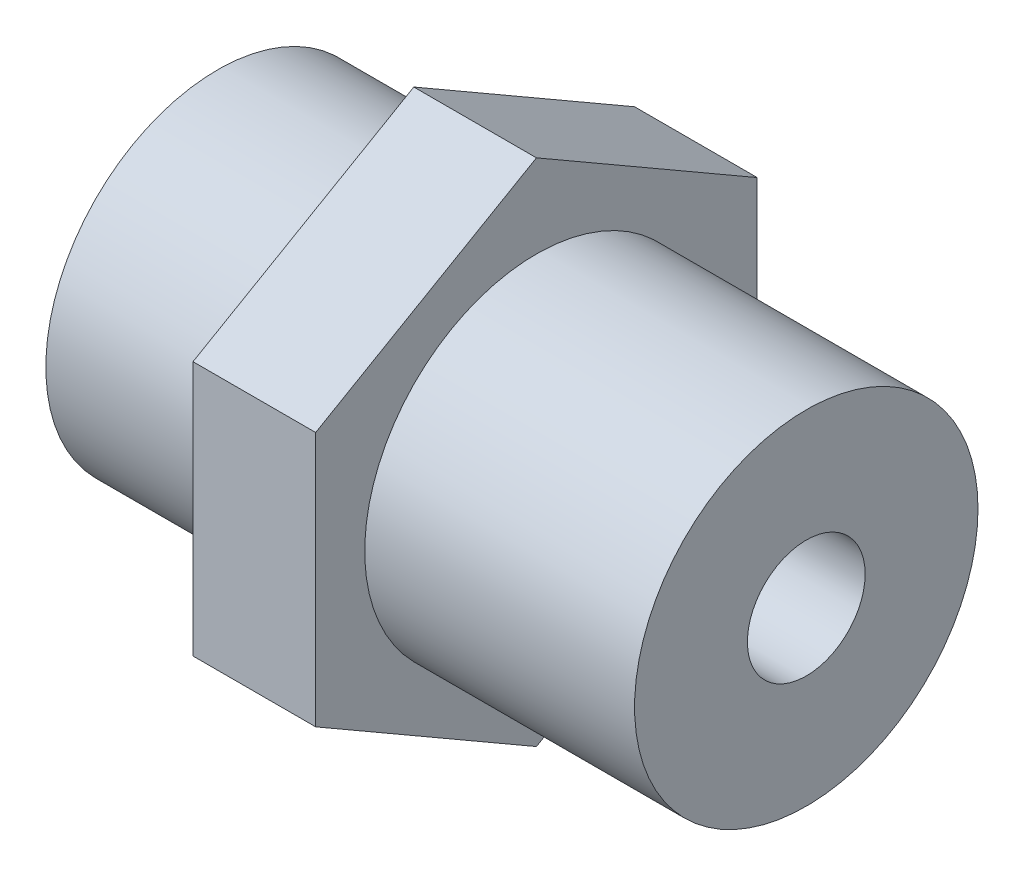
ISO-10303-21;
HEADER;
FILE_DESCRIPTION(('STEP AP214'),'2;1');
FILE_NAME('part.step','',(''),(''),'','','');
FILE_SCHEMA(('AUTOMOTIVE_DESIGN { 1 0 10303 214 1 1 1 1 }'));
ENDSEC;
DATA;
#1=APPLICATION_CONTEXT('core data for automotive mechanical design processes');
#2=APPLICATION_PROTOCOL_DEFINITION('international standard','automotive_design',2000,#1);
#3=PRODUCT_CONTEXT('',#1,'mechanical');
#4=PRODUCT('Part','Part','',(#3));
#5=PRODUCT_RELATED_PRODUCT_CATEGORY('part','',(#4));
#6=PRODUCT_DEFINITION_FORMATION('','',#4);
#7=PRODUCT_DEFINITION_CONTEXT('part definition',#1,'design');
#8=PRODUCT_DEFINITION('design','',#6,#7);
#9=PRODUCT_DEFINITION_SHAPE('','',#8);
#10=(LENGTH_UNIT() NAMED_UNIT(*) SI_UNIT(.MILLI.,.METRE.));
#11=(NAMED_UNIT(*) PLANE_ANGLE_UNIT() SI_UNIT($,.RADIAN.));
#12=(NAMED_UNIT(*) SI_UNIT($,.STERADIAN.) SOLID_ANGLE_UNIT());
#13=UNCERTAINTY_MEASURE_WITH_UNIT(LENGTH_MEASURE(1.E-05),#10,'distance_accuracy_value','');
#14=(GEOMETRIC_REPRESENTATION_CONTEXT(3) GLOBAL_UNCERTAINTY_ASSIGNED_CONTEXT((#13)) GLOBAL_UNIT_ASSIGNED_CONTEXT((#10,
#11,#12)) REPRESENTATION_CONTEXT('',''));
#15=CARTESIAN_POINT('',(0.,0.,0.));
#16=DIRECTION('',(0.,0.,1.));
#17=DIRECTION('',(1.,0.,0.));
#18=AXIS2_PLACEMENT_3D('',#15,#16,#17);
#19=CARTESIAN_POINT('',(-44.,-16.,60.4));
#20=DIRECTION('',(1.,0.,0.));
#21=DIRECTION('',(0.,0.,-1.));
#22=AXIS2_PLACEMENT_3D('',#19,#20,#21);
#23=CYLINDRICAL_SURFACE('',#22,3.5);
#24=CARTESIAN_POINT('',(-44.,-16.,60.4));
#25=DIRECTION('',(1.,0.,0.));
#26=DIRECTION('',(0.,0.,-1.));
#27=AXIS2_PLACEMENT_3D('',#24,#25,#26);
#28=CIRCLE('',#27,3.5);
#29=CARTESIAN_POINT('',(-44.,-16.,56.9));
#30=VERTEX_POINT('',#29);
#31=EDGE_CURVE('E43',#30,#30,#28,.T.);
#32=ORIENTED_EDGE('',*,*,#31,.T.);
#33=EDGE_LOOP('',(#32));
#34=FACE_BOUND('',#33,.T.);
#35=CARTESIAN_POINT('',(-40.,-16.,60.4));
#36=DIRECTION('',(1.,0.,0.));
#37=DIRECTION('',(0.,0.,-1.));
#38=AXIS2_PLACEMENT_3D('',#35,#36,#37);
#39=CIRCLE('',#38,3.5);
#40=CARTESIAN_POINT('',(-40.,-16.,56.9));
#41=VERTEX_POINT('',#40);
#42=EDGE_CURVE('E140',#41,#41,#39,.F.);
#43=ORIENTED_EDGE('',*,*,#42,.T.);
#44=EDGE_LOOP('',(#43));
#45=FACE_BOUND('',#44,.T.);
#46=ADVANCED_FACE('F33',(#34,#45),#23,.T.);
#47=CARTESIAN_POINT('',(-37.5,-16.,60.4));
#48=DIRECTION('',(1.,0.,0.));
#49=DIRECTION('',(0.,0.,-1.));
#50=AXIS2_PLACEMENT_3D('',#47,#48,#49);
#51=CIRCLE('',#50,3.5);
#52=CARTESIAN_POINT('',(-37.5,-16.,56.9));
#53=VERTEX_POINT('',#52);
#54=EDGE_CURVE('E11',#53,#53,#51,.F.);
#55=ORIENTED_EDGE('',*,*,#54,.F.);
#56=EDGE_LOOP('',(#55));
#57=FACE_BOUND('',#56,.T.);
#58=CARTESIAN_POINT('',(-32.,-16.,60.4));
#59=DIRECTION('',(1.,0.,0.));
#60=DIRECTION('',(0.,0.,-1.));
#61=AXIS2_PLACEMENT_3D('',#58,#59,#60);
#62=CIRCLE('',#61,3.5);
#63=CARTESIAN_POINT('',(-32.,-16.,56.9));
#64=VERTEX_POINT('',#63);
#65=EDGE_CURVE('E37',#64,#64,#62,.T.);
#66=ORIENTED_EDGE('',*,*,#65,.F.);
#67=EDGE_LOOP('',(#66));
#68=FACE_BOUND('',#67,.T.);
#69=ADVANCED_FACE('F35',(#57,#68),#23,.T.);
#70=CARTESIAN_POINT('',(-44.,-16.,60.4));
#71=DIRECTION('',(1.,0.,0.));
#72=DIRECTION('',(0.,0.,-1.));
#73=AXIS2_PLACEMENT_3D('',#70,#71,#72);
#74=PLANE('',#73);
#75=CARTESIAN_POINT('',(-44.,-16.,60.4));
#76=DIRECTION('',(1.,0.,0.));
#77=DIRECTION('',(0.,0.,-1.));
#78=AXIS2_PLACEMENT_3D('',#75,#76,#77);
#79=CIRCLE('',#78,1.2);
#80=CARTESIAN_POINT('',(-44.,-16.,59.2));
#81=VERTEX_POINT('',#80);
#82=EDGE_CURVE('E144',#81,#81,#79,.T.);
#83=ORIENTED_EDGE('',*,*,#82,.T.);
#84=EDGE_LOOP('',(#83));
#85=FACE_BOUND('',#84,.T.);
#86=ORIENTED_EDGE('',*,*,#31,.F.);
#87=EDGE_LOOP('',(#86));
#88=FACE_BOUND('',#87,.T.);
#89=ADVANCED_FACE('F157',(#85,#88),#74,.F.);
#90=CARTESIAN_POINT('',(-32.,-16.,60.4));
#91=DIRECTION('',(1.,0.,0.));
#92=DIRECTION('',(0.,0.,-1.));
#93=AXIS2_PLACEMENT_3D('',#90,#91,#92);
#94=PLANE('',#93);
#95=CARTESIAN_POINT('',(-32.,-16.,60.4));
#96=DIRECTION('',(1.,0.,0.));
#97=DIRECTION('',(0.,0.,-1.));
#98=AXIS2_PLACEMENT_3D('',#95,#96,#97);
#99=CIRCLE('',#98,1.2);
#100=CARTESIAN_POINT('',(-32.,-16.,59.2));
#101=VERTEX_POINT('',#100);
#102=EDGE_CURVE('E142',#101,#101,#99,.T.);
#103=ORIENTED_EDGE('',*,*,#102,.F.);
#104=EDGE_LOOP('',(#103));
#105=FACE_BOUND('',#104,.T.);
#106=ORIENTED_EDGE('',*,*,#65,.T.);
#107=EDGE_LOOP('',(#106));
#108=FACE_BOUND('',#107,.T.);
#109=ADVANCED_FACE('F154',(#105,#108),#94,.T.);
#110=CARTESIAN_POINT('',(-44.,-16.,60.4));
#111=DIRECTION('',(1.,0.,0.));
#112=DIRECTION('',(0.,0.,-1.));
#113=AXIS2_PLACEMENT_3D('',#110,#111,#112);
#114=CYLINDRICAL_SURFACE('',#113,1.2);
#115=ORIENTED_EDGE('',*,*,#102,.T.);
#116=EDGE_LOOP('',(#115));
#117=FACE_BOUND('',#116,.T.);
#118=ORIENTED_EDGE('',*,*,#82,.F.);
#119=EDGE_LOOP('',(#118));
#120=FACE_BOUND('',#119,.T.);
#121=ADVANCED_FACE('F169',(#117,#120),#114,.F.);
#122=CARTESIAN_POINT('',(-37.5,0.,0.));
#123=DIRECTION('',(1.,0.,0.));
#124=DIRECTION('',(0.,0.,-1.));
#125=AXIS2_PLACEMENT_3D('',#122,#123,#124);
#126=PLANE('',#125);
#127=ORIENTED_EDGE('',*,*,#54,.T.);
#128=EDGE_LOOP('',(#127));
#129=FACE_BOUND('',#128,.T.);
#130=DIRECTION('',(0.,0.5,0.866025403784438));
#131=VECTOR('',#130,1.);
#132=CARTESIAN_POINT('',(-37.5,-13.4019237886467,55.9));
#133=LINE('',#132,#131);
#134=CARTESIAN_POINT('',(-37.5,-13.4019237886467,55.9));
#135=VERTEX_POINT('',#134);
#136=CARTESIAN_POINT('',(-37.5,-10.8038475772934,60.4));
#137=VERTEX_POINT('',#136);
#138=EDGE_CURVE('E131',#135,#137,#133,.T.);
#139=ORIENTED_EDGE('',*,*,#138,.T.);
#140=DIRECTION('',(0.,-0.5,0.866025403784438));
#141=VECTOR('',#140,1.);
#142=CARTESIAN_POINT('',(-37.5,-10.8038475772934,60.4));
#143=LINE('',#142,#141);
#144=CARTESIAN_POINT('',(-37.5,-13.4019237886467,64.9));
#145=VERTEX_POINT('',#144);
#146=EDGE_CURVE('E90',#137,#145,#143,.T.);
#147=ORIENTED_EDGE('',*,*,#146,.T.);
#148=DIRECTION('',(0.,-1.,0.));
#149=VECTOR('',#148,1.);
#150=CARTESIAN_POINT('',(-37.5,-13.4019237886467,64.9));
#151=LINE('',#150,#149);
#152=CARTESIAN_POINT('',(-37.5,-18.5980762113533,64.9));
#153=VERTEX_POINT('',#152);
#154=EDGE_CURVE('E103',#145,#153,#151,.T.);
#155=ORIENTED_EDGE('',*,*,#154,.T.);
#156=DIRECTION('',(0.,-0.499999999999999,-0.866025403784439));
#157=VECTOR('',#156,1.);
#158=CARTESIAN_POINT('',(-37.5,-18.5980762113533,64.9));
#159=LINE('',#158,#157);
#160=CARTESIAN_POINT('',(-37.5,-21.1961524227066,60.4));
#161=VERTEX_POINT('',#160);
#162=EDGE_CURVE('E97',#153,#161,#159,.T.);
#163=ORIENTED_EDGE('',*,*,#162,.T.);
#164=DIRECTION('',(0.,0.5,-0.866025403784439));
#165=VECTOR('',#164,1.);
#166=CARTESIAN_POINT('',(-37.5,-21.1961524227066,60.4));
#167=LINE('',#166,#165);
#168=CARTESIAN_POINT('',(-37.5,-18.5980762113533,55.9));
#169=VERTEX_POINT('',#168);
#170=EDGE_CURVE('E101',#161,#169,#167,.T.);
#171=ORIENTED_EDGE('',*,*,#170,.T.);
#172=DIRECTION('',(0.,1.,0.));
#173=VECTOR('',#172,1.);
#174=CARTESIAN_POINT('',(-37.5,-18.5980762113533,55.9));
#175=LINE('',#174,#173);
#176=EDGE_CURVE('E52',#169,#135,#175,.T.);
#177=ORIENTED_EDGE('',*,*,#176,.T.);
#178=EDGE_LOOP('',(#139,#147,#155,#163,#171,#177));
#179=FACE_BOUND('',#178,.T.);
#180=ADVANCED_FACE('F99',(#129,#179),#126,.T.);
#181=CARTESIAN_POINT('',(-40.,0.,0.));
#182=DIRECTION('',(1.,0.,0.));
#183=DIRECTION('',(0.,0.,-1.));
#184=AXIS2_PLACEMENT_3D('',#181,#182,#183);
#185=PLANE('',#184);
#186=ORIENTED_EDGE('',*,*,#42,.F.);
#187=EDGE_LOOP('',(#186));
#188=FACE_BOUND('',#187,.T.);
#189=DIRECTION('',(0.,0.5,0.866025403784438));
#190=VECTOR('',#189,1.);
#191=CARTESIAN_POINT('',(-40.,-13.4019237886467,55.9));
#192=LINE('',#191,#190);
#193=CARTESIAN_POINT('',(-40.,-13.4019237886467,55.9));
#194=VERTEX_POINT('',#193);
#195=CARTESIAN_POINT('',(-40.,-10.8038475772934,60.4));
#196=VERTEX_POINT('',#195);
#197=EDGE_CURVE('E121',#194,#196,#192,.T.);
#198=ORIENTED_EDGE('',*,*,#197,.F.);
#199=DIRECTION('',(0.,1.,0.));
#200=VECTOR('',#199,1.);
#201=CARTESIAN_POINT('',(-40.,-18.5980762113533,55.9));
#202=LINE('',#201,#200);
#203=CARTESIAN_POINT('',(-40.,-18.5980762113533,55.9));
#204=VERTEX_POINT('',#203);
#205=EDGE_CURVE('E81',#204,#194,#202,.T.);
#206=ORIENTED_EDGE('',*,*,#205,.F.);
#207=DIRECTION('',(0.,0.5,-0.866025403784439));
#208=VECTOR('',#207,1.);
#209=CARTESIAN_POINT('',(-40.,-21.1961524227066,60.4));
#210=LINE('',#209,#208);
#211=CARTESIAN_POINT('',(-40.,-21.1961524227066,60.4));
#212=VERTEX_POINT('',#211);
#213=EDGE_CURVE('E75',#212,#204,#210,.T.);
#214=ORIENTED_EDGE('',*,*,#213,.F.);
#215=DIRECTION('',(0.,-0.499999999999999,-0.866025403784439));
#216=VECTOR('',#215,1.);
#217=CARTESIAN_POINT('',(-40.,-18.5980762113533,64.9));
#218=LINE('',#217,#216);
#219=CARTESIAN_POINT('',(-40.,-18.5980762113533,64.9));
#220=VERTEX_POINT('',#219);
#221=EDGE_CURVE('E111',#220,#212,#218,.T.);
#222=ORIENTED_EDGE('',*,*,#221,.F.);
#223=DIRECTION('',(0.,-1.,0.));
#224=VECTOR('',#223,1.);
#225=CARTESIAN_POINT('',(-40.,-13.4019237886467,64.9));
#226=LINE('',#225,#224);
#227=CARTESIAN_POINT('',(-40.,-13.4019237886467,64.9));
#228=VERTEX_POINT('',#227);
#229=EDGE_CURVE('E126',#228,#220,#226,.T.);
#230=ORIENTED_EDGE('',*,*,#229,.F.);
#231=DIRECTION('',(0.,-0.5,0.866025403784438));
#232=VECTOR('',#231,1.);
#233=CARTESIAN_POINT('',(-40.,-10.8038475772934,60.4));
#234=LINE('',#233,#232);
#235=EDGE_CURVE('E124',#196,#228,#234,.T.);
#236=ORIENTED_EDGE('',*,*,#235,.F.);
#237=EDGE_LOOP('',(#198,#206,#214,#222,#230,#236));
#238=FACE_BOUND('',#237,.T.);
#239=ADVANCED_FACE('F168',(#188,#238),#185,.F.);
#240=CARTESIAN_POINT('',(-37.5,-13.4019237886467,55.9));
#241=DIRECTION('',(0.,-0.866025403784438,0.5));
#242=DIRECTION('',(0.,-0.5,-0.866025403784439));
#243=AXIS2_PLACEMENT_3D('',#240,#241,#242);
#244=PLANE('',#243);
#245=ORIENTED_EDGE('',*,*,#197,.T.);
#246=DIRECTION('',(-1.,0.,0.));
#247=VECTOR('',#246,1.);
#248=CARTESIAN_POINT('',(-37.5,-10.8038475772934,60.4));
#249=LINE('',#248,#247);
#250=EDGE_CURVE('E138',#137,#196,#249,.T.);
#251=ORIENTED_EDGE('',*,*,#250,.F.);
#252=ORIENTED_EDGE('',*,*,#138,.F.);
#253=DIRECTION('',(-1.,0.,0.));
#254=VECTOR('',#253,1.);
#255=CARTESIAN_POINT('',(-37.5,-13.4019237886467,55.9));
#256=LINE('',#255,#254);
#257=EDGE_CURVE('E117',#135,#194,#256,.T.);
#258=ORIENTED_EDGE('',*,*,#257,.T.);
#259=EDGE_LOOP('',(#245,#251,#252,#258));
#260=FACE_BOUND('',#259,.T.);
#261=ADVANCED_FACE('F175',(#260),#244,.F.);
#262=CARTESIAN_POINT('',(-37.5,-10.8038475772934,60.4));
#263=DIRECTION('',(0.,-0.866025403784438,-0.5));
#264=DIRECTION('',(0.,0.5,-0.866025403784438));
#265=AXIS2_PLACEMENT_3D('',#262,#263,#264);
#266=PLANE('',#265);
#267=ORIENTED_EDGE('',*,*,#235,.T.);
#268=DIRECTION('',(-1.,0.,0.));
#269=VECTOR('',#268,1.);
#270=CARTESIAN_POINT('',(-37.5,-13.4019237886467,64.9));
#271=LINE('',#270,#269);
#272=EDGE_CURVE('E135',#145,#228,#271,.T.);
#273=ORIENTED_EDGE('',*,*,#272,.F.);
#274=ORIENTED_EDGE('',*,*,#146,.F.);
#275=ORIENTED_EDGE('',*,*,#250,.T.);
#276=EDGE_LOOP('',(#267,#273,#274,#275));
#277=FACE_BOUND('',#276,.T.);
#278=ADVANCED_FACE('F191',(#277),#266,.F.);
#279=CARTESIAN_POINT('',(-37.5,-13.4019237886467,64.9));
#280=DIRECTION('',(0.,0.,-1.));
#281=DIRECTION('',(0.,1.,0.));
#282=AXIS2_PLACEMENT_3D('',#279,#280,#281);
#283=PLANE('',#282);
#284=ORIENTED_EDGE('',*,*,#229,.T.);
#285=DIRECTION('',(-1.,0.,0.));
#286=VECTOR('',#285,1.);
#287=CARTESIAN_POINT('',(-37.5,-18.5980762113533,64.9));
#288=LINE('',#287,#286);
#289=EDGE_CURVE('E112',#153,#220,#288,.T.);
#290=ORIENTED_EDGE('',*,*,#289,.F.);
#291=ORIENTED_EDGE('',*,*,#154,.F.);
#292=ORIENTED_EDGE('',*,*,#272,.T.);
#293=EDGE_LOOP('',(#284,#290,#291,#292));
#294=FACE_BOUND('',#293,.T.);
#295=ADVANCED_FACE('F188',(#294),#283,.F.);
#296=CARTESIAN_POINT('',(-37.5,-18.5980762113533,64.9));
#297=DIRECTION('',(0.,0.866025403784439,-0.499999999999999));
#298=DIRECTION('',(0.,0.499999999999999,0.866025403784439));
#299=AXIS2_PLACEMENT_3D('',#296,#297,#298);
#300=PLANE('',#299);
#301=ORIENTED_EDGE('',*,*,#221,.T.);
#302=DIRECTION('',(-1.,0.,0.));
#303=VECTOR('',#302,1.);
#304=CARTESIAN_POINT('',(-37.5,-21.1961524227066,60.4));
#305=LINE('',#304,#303);
#306=EDGE_CURVE('E108',#161,#212,#305,.T.);
#307=ORIENTED_EDGE('',*,*,#306,.F.);
#308=ORIENTED_EDGE('',*,*,#162,.F.);
#309=ORIENTED_EDGE('',*,*,#289,.T.);
#310=EDGE_LOOP('',(#301,#307,#308,#309));
#311=FACE_BOUND('',#310,.T.);
#312=ADVANCED_FACE('F109',(#311),#300,.F.);
#313=CARTESIAN_POINT('',(-37.5,-21.1961524227066,60.4));
#314=DIRECTION('',(0.,0.866025403784439,0.5));
#315=DIRECTION('',(0.,-0.5,0.866025403784439));
#316=AXIS2_PLACEMENT_3D('',#313,#314,#315);
#317=PLANE('',#316);
#318=ORIENTED_EDGE('',*,*,#213,.T.);
#319=DIRECTION('',(-1.,0.,0.));
#320=VECTOR('',#319,1.);
#321=CARTESIAN_POINT('',(-37.5,-18.5980762113533,55.9));
#322=LINE('',#321,#320);
#323=EDGE_CURVE('E113',#169,#204,#322,.T.);
#324=ORIENTED_EDGE('',*,*,#323,.F.);
#325=ORIENTED_EDGE('',*,*,#170,.F.);
#326=ORIENTED_EDGE('',*,*,#306,.T.);
#327=EDGE_LOOP('',(#318,#324,#325,#326));
#328=FACE_BOUND('',#327,.T.);
#329=ADVANCED_FACE('F115',(#328),#317,.F.);
#330=CARTESIAN_POINT('',(-37.5,-18.5980762113533,55.9));
#331=DIRECTION('',(0.,0.,1.));
#332=DIRECTION('',(1.,0.,0.));
#333=AXIS2_PLACEMENT_3D('',#330,#331,#332);
#334=PLANE('',#333);
#335=ORIENTED_EDGE('',*,*,#205,.T.);
#336=ORIENTED_EDGE('',*,*,#257,.F.);
#337=ORIENTED_EDGE('',*,*,#176,.F.);
#338=ORIENTED_EDGE('',*,*,#323,.T.);
#339=EDGE_LOOP('',(#335,#336,#337,#338));
#340=FACE_BOUND('',#339,.T.);
#341=ADVANCED_FACE('F181',(#340),#334,.F.);
#342=CLOSED_SHELL('',(#46,#69,#89,#109,#121,#180,#239,#261,#278,#295,#312,#329,#341));
#343=MANIFOLD_SOLID_BREP('B2',#342);
#344=ADVANCED_BREP_SHAPE_REPRESENTATION('',(#18,#343),#14);
#345=SHAPE_DEFINITION_REPRESENTATION(#9,#344);
ENDSEC;
END-ISO-10303-21;
